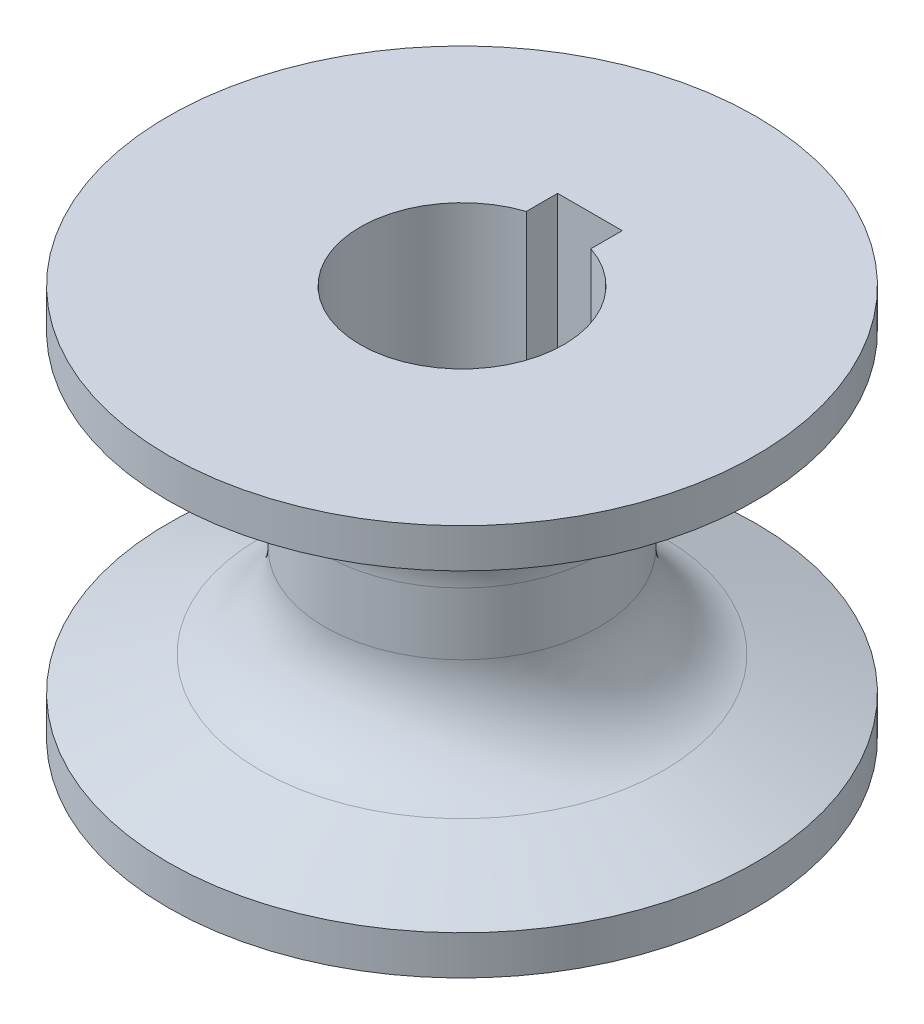
ISO-10303-21;
HEADER;
FILE_DESCRIPTION(('STEP AP214'),'2;1');
FILE_NAME('part.step','',(''),(''),'','','');
FILE_SCHEMA(('AUTOMOTIVE_DESIGN { 1 0 10303 214 1 1 1 1 }'));
ENDSEC;
DATA;
#1=APPLICATION_CONTEXT('core data for automotive mechanical design processes');
#2=APPLICATION_PROTOCOL_DEFINITION('international standard','automotive_design',2000,#1);
#3=PRODUCT_CONTEXT('',#1,'mechanical');
#4=PRODUCT('Part','Part','',(#3));
#5=PRODUCT_RELATED_PRODUCT_CATEGORY('part','',(#4));
#6=PRODUCT_DEFINITION_FORMATION('','',#4);
#7=PRODUCT_DEFINITION_CONTEXT('part definition',#1,'design');
#8=PRODUCT_DEFINITION('design','',#6,#7);
#9=PRODUCT_DEFINITION_SHAPE('','',#8);
#10=(LENGTH_UNIT() NAMED_UNIT(*) SI_UNIT(.MILLI.,.METRE.));
#11=(NAMED_UNIT(*) PLANE_ANGLE_UNIT() SI_UNIT($,.RADIAN.));
#12=(NAMED_UNIT(*) SI_UNIT($,.STERADIAN.) SOLID_ANGLE_UNIT());
#13=UNCERTAINTY_MEASURE_WITH_UNIT(LENGTH_MEASURE(1.E-05),#10,'distance_accuracy_value','');
#14=(GEOMETRIC_REPRESENTATION_CONTEXT(3) GLOBAL_UNCERTAINTY_ASSIGNED_CONTEXT((#13)) GLOBAL_UNIT_ASSIGNED_CONTEXT((#10,
#11,#12)) REPRESENTATION_CONTEXT('',''));
#15=CARTESIAN_POINT('',(0.,0.,0.));
#16=DIRECTION('',(0.,0.,1.));
#17=DIRECTION('',(1.,0.,0.));
#18=AXIS2_PLACEMENT_3D('',#15,#16,#17);
#19=CARTESIAN_POINT('',(0.,20.,0.));
#20=DIRECTION('',(0.,-1.,0.));
#21=DIRECTION('',(0.,0.,-1.));
#22=AXIS2_PLACEMENT_3D('',#19,#20,#21);
#23=CYLINDRICAL_SURFACE('',#22,15.);
#24=CARTESIAN_POINT('',(0.,20.,0.));
#25=DIRECTION('',(0.,1.,0.));
#26=DIRECTION('',(0.,0.,1.));
#27=AXIS2_PLACEMENT_3D('',#24,#25,#26);
#28=CIRCLE('',#27,15.);
#29=CARTESIAN_POINT('',(0.,20.,15.));
#30=VERTEX_POINT('',#29);
#31=EDGE_CURVE('E134',#30,#30,#28,.T.);
#32=ORIENTED_EDGE('',*,*,#31,.F.);
#33=EDGE_LOOP('',(#32));
#34=FACE_BOUND('',#33,.T.);
#35=CARTESIAN_POINT('',(0.,18.,0.));
#36=DIRECTION('',(0.,-1.,0.));
#37=DIRECTION('',(0.,0.,-1.));
#38=AXIS2_PLACEMENT_3D('',#35,#36,#37);
#39=CIRCLE('',#38,15.);
#40=CARTESIAN_POINT('',(0.,18.,-15.));
#41=VERTEX_POINT('',#40);
#42=EDGE_CURVE('E112',#41,#41,#39,.T.);
#43=ORIENTED_EDGE('',*,*,#42,.F.);
#44=EDGE_LOOP('',(#43));
#45=FACE_BOUND('',#44,.T.);
#46=ADVANCED_FACE('F39',(#34,#45),#23,.T.);
#47=CARTESIAN_POINT('',(0.,0.,0.));
#48=DIRECTION('',(0.,1.,0.));
#49=DIRECTION('',(0.,0.,1.));
#50=AXIS2_PLACEMENT_3D('',#47,#48,#49);
#51=CIRCLE('',#50,15.);
#52=CARTESIAN_POINT('',(0.,0.,15.));
#53=VERTEX_POINT('',#52);
#54=EDGE_CURVE('E133',#53,#53,#51,.T.);
#55=ORIENTED_EDGE('',*,*,#54,.T.);
#56=EDGE_LOOP('',(#55));
#57=FACE_BOUND('',#56,.T.);
#58=CARTESIAN_POINT('',(0.,2.,0.));
#59=DIRECTION('',(0.,-1.,0.));
#60=DIRECTION('',(0.,0.,-1.));
#61=AXIS2_PLACEMENT_3D('',#58,#59,#60);
#62=CIRCLE('',#61,15.);
#63=CARTESIAN_POINT('',(0.,2.,-15.));
#64=VERTEX_POINT('',#63);
#65=EDGE_CURVE('E176',#64,#64,#62,.T.);
#66=ORIENTED_EDGE('',*,*,#65,.T.);
#67=EDGE_LOOP('',(#66));
#68=FACE_BOUND('',#67,.T.);
#69=ADVANCED_FACE('F184',(#57,#68),#23,.T.);
#70=CARTESIAN_POINT('',(0.,20.,0.));
#71=DIRECTION('',(0.,1.,0.));
#72=DIRECTION('',(0.,0.,1.));
#73=AXIS2_PLACEMENT_3D('',#70,#71,#72);
#74=PLANE('',#73);
#75=DIRECTION('',(0.,0.,1.));
#76=VECTOR('',#75,1.);
#77=CARTESIAN_POINT('',(-1.65,20.,-4.93127772489037));
#78=LINE('',#77,#76);
#79=CARTESIAN_POINT('',(-1.65,20.,-6.53127772489037));
#80=VERTEX_POINT('',#79);
#81=CARTESIAN_POINT('',(-1.65,20.,-4.93127772489037));
#82=VERTEX_POINT('',#81);
#83=EDGE_CURVE('E80',#80,#82,#78,.T.);
#84=ORIENTED_EDGE('',*,*,#83,.F.);
#85=DIRECTION('',(-1.,0.,0.));
#86=VECTOR('',#85,1.);
#87=CARTESIAN_POINT('',(-1.65,20.,-6.53127772489037));
#88=LINE('',#87,#86);
#89=CARTESIAN_POINT('',(1.65,20.,-6.53127772489037));
#90=VERTEX_POINT('',#89);
#91=EDGE_CURVE('E109',#90,#80,#88,.T.);
#92=ORIENTED_EDGE('',*,*,#91,.F.);
#93=DIRECTION('',(0.,0.,-1.));
#94=VECTOR('',#93,1.);
#95=CARTESIAN_POINT('',(1.65,20.,-6.53127772489037));
#96=LINE('',#95,#94);
#97=CARTESIAN_POINT('',(1.65,20.,-4.93127772489037));
#98=VERTEX_POINT('',#97);
#99=EDGE_CURVE('E86',#98,#90,#96,.T.);
#100=ORIENTED_EDGE('',*,*,#99,.F.);
#101=CARTESIAN_POINT('',(0.,20.,0.));
#102=DIRECTION('',(0.,1.,0.));
#103=DIRECTION('',(0.,0.,1.));
#104=AXIS2_PLACEMENT_3D('',#101,#102,#103);
#105=CIRCLE('',#104,5.2);
#106=EDGE_CURVE('E123',#82,#98,#105,.T.);
#107=ORIENTED_EDGE('',*,*,#106,.F.);
#108=EDGE_LOOP('',(#84,#92,#100,#107));
#109=FACE_BOUND('',#108,.T.);
#110=ORIENTED_EDGE('',*,*,#31,.T.);
#111=EDGE_LOOP('',(#110));
#112=FACE_BOUND('',#111,.T.);
#113=ADVANCED_FACE('F190',(#109,#112),#74,.T.);
#114=CARTESIAN_POINT('',(0.,0.,0.));
#115=DIRECTION('',(0.,1.,0.));
#116=DIRECTION('',(0.,0.,1.));
#117=AXIS2_PLACEMENT_3D('',#114,#115,#116);
#118=PLANE('',#117);
#119=DIRECTION('',(-1.,0.,0.));
#120=VECTOR('',#119,1.);
#121=CARTESIAN_POINT('',(-1.65,0.,-6.53127772489037));
#122=LINE('',#121,#120);
#123=CARTESIAN_POINT('',(1.65,0.,-6.53127772489037));
#124=VERTEX_POINT('',#123);
#125=CARTESIAN_POINT('',(-1.65,0.,-6.53127772489037));
#126=VERTEX_POINT('',#125);
#127=EDGE_CURVE('E95',#124,#126,#122,.T.);
#128=ORIENTED_EDGE('',*,*,#127,.T.);
#129=DIRECTION('',(0.,0.,1.));
#130=VECTOR('',#129,1.);
#131=CARTESIAN_POINT('',(-1.65,0.,-4.93127772489037));
#132=LINE('',#131,#130);
#133=CARTESIAN_POINT('',(-1.65,0.,-4.93127772489037));
#134=VERTEX_POINT('',#133);
#135=EDGE_CURVE('E99',#126,#134,#132,.T.);
#136=ORIENTED_EDGE('',*,*,#135,.T.);
#137=CARTESIAN_POINT('',(0.,0.,0.));
#138=DIRECTION('',(0.,1.,0.));
#139=DIRECTION('',(0.,0.,1.));
#140=AXIS2_PLACEMENT_3D('',#137,#138,#139);
#141=CIRCLE('',#140,5.2);
#142=CARTESIAN_POINT('',(1.65,0.,-4.93127772489037));
#143=VERTEX_POINT('',#142);
#144=EDGE_CURVE('E105',#134,#143,#141,.T.);
#145=ORIENTED_EDGE('',*,*,#144,.T.);
#146=DIRECTION('',(0.,0.,-1.));
#147=VECTOR('',#146,1.);
#148=CARTESIAN_POINT('',(1.65,0.,-6.53127772489037));
#149=LINE('',#148,#147);
#150=EDGE_CURVE('E55',#143,#124,#149,.T.);
#151=ORIENTED_EDGE('',*,*,#150,.T.);
#152=EDGE_LOOP('',(#128,#136,#145,#151));
#153=FACE_BOUND('',#152,.T.);
#154=ORIENTED_EDGE('',*,*,#54,.F.);
#155=EDGE_LOOP('',(#154));
#156=FACE_BOUND('',#155,.T.);
#157=ADVANCED_FACE('F102',(#153,#156),#118,.F.);
#158=CARTESIAN_POINT('',(0.,20.,0.));
#159=DIRECTION('',(0.,1.,0.));
#160=DIRECTION('',(0.,0.,1.));
#161=AXIS2_PLACEMENT_3D('',#158,#159,#160);
#162=CYLINDRICAL_SURFACE('',#161,5.2);
#163=ORIENTED_EDGE('',*,*,#144,.F.);
#164=DIRECTION('',(0.,1.,0.));
#165=VECTOR('',#164,1.);
#166=CARTESIAN_POINT('',(-1.65,0.,-4.93127772489037));
#167=LINE('',#166,#165);
#168=EDGE_CURVE('E64',#134,#82,#167,.T.);
#169=ORIENTED_EDGE('',*,*,#168,.T.);
#170=ORIENTED_EDGE('',*,*,#106,.T.);
#171=DIRECTION('',(0.,1.,0.));
#172=VECTOR('',#171,1.);
#173=CARTESIAN_POINT('',(1.65,0.,-4.93127772489037));
#174=LINE('',#173,#172);
#175=EDGE_CURVE('E92',#143,#98,#174,.T.);
#176=ORIENTED_EDGE('',*,*,#175,.F.);
#177=EDGE_LOOP('',(#163,#169,#170,#176));
#178=FACE_BOUND('',#177,.T.);
#179=ADVANCED_FACE('F196',(#178),#162,.F.);
#180=CARTESIAN_POINT('',(-1.65,0.,-4.93127772489037));
#181=DIRECTION('',(-1.,0.,0.));
#182=DIRECTION('',(0.,0.,1.));
#183=AXIS2_PLACEMENT_3D('',#180,#181,#182);
#184=PLANE('',#183);
#185=ORIENTED_EDGE('',*,*,#83,.T.);
#186=ORIENTED_EDGE('',*,*,#168,.F.);
#187=ORIENTED_EDGE('',*,*,#135,.F.);
#188=DIRECTION('',(0.,1.,0.));
#189=VECTOR('',#188,1.);
#190=CARTESIAN_POINT('',(-1.65,0.,-6.53127772489037));
#191=LINE('',#190,#189);
#192=EDGE_CURVE('E91',#126,#80,#191,.T.);
#193=ORIENTED_EDGE('',*,*,#192,.T.);
#194=EDGE_LOOP('',(#185,#186,#187,#193));
#195=FACE_BOUND('',#194,.T.);
#196=ADVANCED_FACE('F202',(#195),#184,.F.);
#197=CARTESIAN_POINT('',(-1.65,0.,-6.53127772489037));
#198=DIRECTION('',(0.,0.,-1.));
#199=DIRECTION('',(-1.,0.,0.));
#200=AXIS2_PLACEMENT_3D('',#197,#198,#199);
#201=PLANE('',#200);
#202=ORIENTED_EDGE('',*,*,#91,.T.);
#203=ORIENTED_EDGE('',*,*,#192,.F.);
#204=ORIENTED_EDGE('',*,*,#127,.F.);
#205=DIRECTION('',(0.,1.,0.));
#206=VECTOR('',#205,1.);
#207=CARTESIAN_POINT('',(1.65,0.,-6.53127772489037));
#208=LINE('',#207,#206);
#209=EDGE_CURVE('E82',#124,#90,#208,.T.);
#210=ORIENTED_EDGE('',*,*,#209,.T.);
#211=EDGE_LOOP('',(#202,#203,#204,#210));
#212=FACE_BOUND('',#211,.T.);
#213=ADVANCED_FACE('F96',(#212),#201,.F.);
#214=CARTESIAN_POINT('',(1.65,0.,-6.53127772489037));
#215=DIRECTION('',(1.,0.,0.));
#216=DIRECTION('',(0.,0.,-1.));
#217=AXIS2_PLACEMENT_3D('',#214,#215,#216);
#218=PLANE('',#217);
#219=ORIENTED_EDGE('',*,*,#99,.T.);
#220=ORIENTED_EDGE('',*,*,#209,.F.);
#221=ORIENTED_EDGE('',*,*,#150,.F.);
#222=ORIENTED_EDGE('',*,*,#175,.T.);
#223=EDGE_LOOP('',(#219,#220,#221,#222));
#224=FACE_BOUND('',#223,.T.);
#225=ADVANCED_FACE('F84',(#224),#218,.F.);
#226=CARTESIAN_POINT('',(0.,15.0882381258703,0.));
#227=DIRECTION('',(0.,1.,0.));
#228=DIRECTION('',(0.,0.,1.));
#229=AXIS2_PLACEMENT_3D('',#226,#227,#228);
#230=CONICAL_SURFACE('',#229,7.,1.22173047639603);
#231=CARTESIAN_POINT('',(0.,16.2856635387513,0.));
#232=DIRECTION('',(0.,1.,0.));
#233=DIRECTION('',(0.,0.,1.));
#234=AXIS2_PLACEMENT_3D('',#231,#232,#233);
#235=CIRCLE('',#234,10.2898992833716);
#236=CARTESIAN_POINT('',(0.,16.2856635387513,10.2898992833716));
#237=VERTEX_POINT('',#236);
#238=EDGE_CURVE('E48',#237,#237,#235,.T.);
#239=ORIENTED_EDGE('',*,*,#238,.T.);
#240=EDGE_LOOP('',(#239));
#241=FACE_BOUND('',#240,.T.);
#242=ORIENTED_EDGE('',*,*,#42,.T.);
#243=EDGE_LOOP('',(#242));
#244=FACE_BOUND('',#243,.T.);
#245=ADVANCED_FACE('F152',(#241,#244),#230,.T.);
#246=CARTESIAN_POINT('',(0.,2.,0.));
#247=DIRECTION('',(0.,-1.,0.));
#248=DIRECTION('',(0.,0.,-1.));
#249=AXIS2_PLACEMENT_3D('',#246,#247,#248);
#250=CONICAL_SURFACE('',#249,15.,1.22173047639603);
#251=CARTESIAN_POINT('',(0.,3.71433646124866,0.));
#252=DIRECTION('',(0.,-1.,0.));
#253=DIRECTION('',(0.,0.,-1.));
#254=AXIS2_PLACEMENT_3D('',#251,#252,#253);
#255=CIRCLE('',#254,10.2898992833716);
#256=CARTESIAN_POINT('',(0.,3.71433646124866,-10.2898992833716));
#257=VERTEX_POINT('',#256);
#258=EDGE_CURVE('E11',#257,#257,#255,.T.);
#259=ORIENTED_EDGE('',*,*,#258,.T.);
#260=EDGE_LOOP('',(#259));
#261=FACE_BOUND('',#260,.T.);
#262=ORIENTED_EDGE('',*,*,#65,.F.);
#263=EDGE_LOOP('',(#262));
#264=FACE_BOUND('',#263,.T.);
#265=ADVANCED_FACE('F163',(#261,#264),#250,.T.);
#266=CARTESIAN_POINT('',(0.,0.,0.));
#267=DIRECTION('',(0.,-1.,0.));
#268=DIRECTION('',(0.,0.,-1.));
#269=AXIS2_PLACEMENT_3D('',#266,#267,#268);
#270=CYLINDRICAL_SURFACE('',#269,7.);
#271=CARTESIAN_POINT('',(0.,11.5872004348218,0.));
#272=DIRECTION('',(0.,-1.,0.));
#273=DIRECTION('',(0.,0.,-1.));
#274=AXIS2_PLACEMENT_3D('',#271,#272,#273);
#275=CIRCLE('',#274,7.);
#276=CARTESIAN_POINT('',(0.,11.5872004348218,-7.));
#277=VERTEX_POINT('',#276);
#278=EDGE_CURVE('E145',#277,#277,#275,.T.);
#279=ORIENTED_EDGE('',*,*,#278,.T.);
#280=EDGE_LOOP('',(#279));
#281=FACE_BOUND('',#280,.T.);
#282=CARTESIAN_POINT('',(0.,8.41279956517819,0.));
#283=DIRECTION('',(0.,-1.,0.));
#284=DIRECTION('',(0.,0.,-1.));
#285=AXIS2_PLACEMENT_3D('',#282,#283,#284);
#286=CIRCLE('',#285,7.);
#287=CARTESIAN_POINT('',(0.,8.41279956517819,-7.));
#288=VERTEX_POINT('',#287);
#289=EDGE_CURVE('E138',#288,#288,#286,.F.);
#290=ORIENTED_EDGE('',*,*,#289,.T.);
#291=EDGE_LOOP('',(#290));
#292=FACE_BOUND('',#291,.T.);
#293=ADVANCED_FACE('F158',(#281,#292),#270,.T.);
#294=CARTESIAN_POINT('',(0.,11.5872004348218,0.));
#295=DIRECTION('',(0.,-1.,0.));
#296=DIRECTION('',(0.,0.,-1.));
#297=AXIS2_PLACEMENT_3D('',#294,#295,#296);
#298=TOROIDAL_SURFACE('',#297,12.,5.);
#299=ORIENTED_EDGE('',*,*,#238,.F.);
#300=EDGE_LOOP('',(#299));
#301=FACE_BOUND('',#300,.T.);
#302=ORIENTED_EDGE('',*,*,#278,.F.);
#303=EDGE_LOOP('',(#302));
#304=FACE_BOUND('',#303,.T.);
#305=ADVANCED_FACE('F155',(#301,#304),#298,.F.);
#306=CARTESIAN_POINT('',(0.,8.41279956517819,0.));
#307=DIRECTION('',(0.,-1.,0.));
#308=DIRECTION('',(0.,0.,-1.));
#309=AXIS2_PLACEMENT_3D('',#306,#307,#308);
#310=TOROIDAL_SURFACE('',#309,12.,5.);
#311=ORIENTED_EDGE('',*,*,#289,.F.);
#312=EDGE_LOOP('',(#311));
#313=FACE_BOUND('',#312,.T.);
#314=ORIENTED_EDGE('',*,*,#258,.F.);
#315=EDGE_LOOP('',(#314));
#316=FACE_BOUND('',#315,.T.);
#317=ADVANCED_FACE('F41',(#313,#316),#310,.F.);
#318=CLOSED_SHELL('',(#46,#69,#113,#157,#179,#196,#213,#225,#245,#265,#293,#305,#317));
#319=MANIFOLD_SOLID_BREP('B2',#318);
#320=ADVANCED_BREP_SHAPE_REPRESENTATION('',(#18,#319),#14);
#321=SHAPE_DEFINITION_REPRESENTATION(#9,#320);
ENDSEC;
END-ISO-10303-21;
